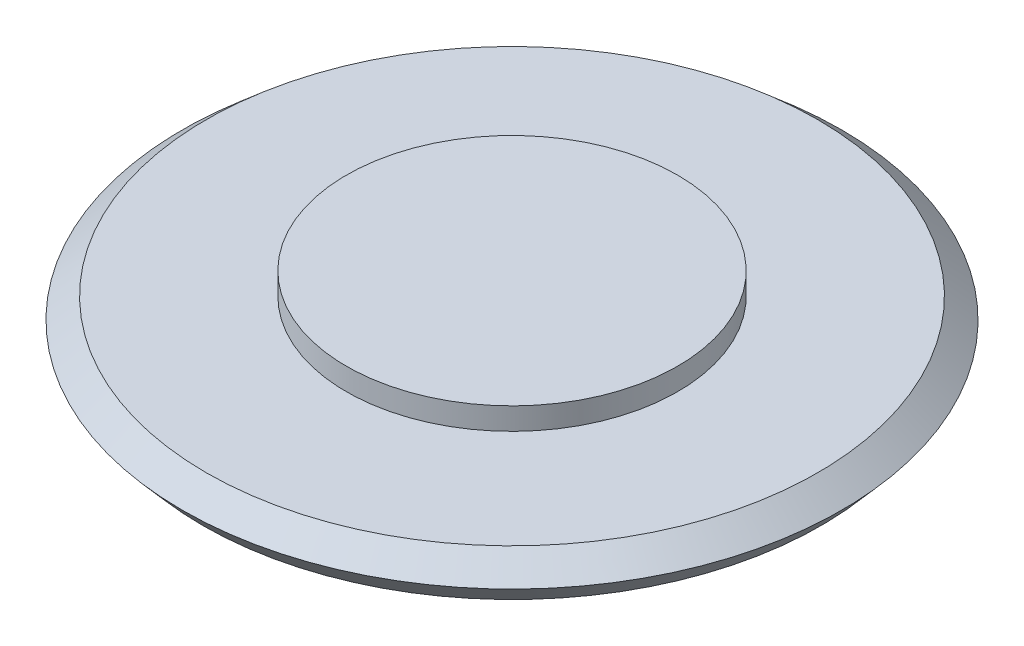
ISO-10303-21;
HEADER;
FILE_DESCRIPTION(('STEP AP214'),'2;1');
FILE_NAME('part.step','',(''),(''),'','','');
FILE_SCHEMA(('AUTOMOTIVE_DESIGN { 1 0 10303 214 1 1 1 1 }'));
ENDSEC;
DATA;
#1=APPLICATION_CONTEXT('core data for automotive mechanical design processes');
#2=APPLICATION_PROTOCOL_DEFINITION('international standard','automotive_design',2000,#1);
#3=PRODUCT_CONTEXT('',#1,'mechanical');
#4=PRODUCT('Part','Part','',(#3));
#5=PRODUCT_RELATED_PRODUCT_CATEGORY('part','',(#4));
#6=PRODUCT_DEFINITION_FORMATION('','',#4);
#7=PRODUCT_DEFINITION_CONTEXT('part definition',#1,'design');
#8=PRODUCT_DEFINITION('design','',#6,#7);
#9=PRODUCT_DEFINITION_SHAPE('','',#8);
#10=(LENGTH_UNIT() NAMED_UNIT(*) SI_UNIT(.MILLI.,.METRE.));
#11=(NAMED_UNIT(*) PLANE_ANGLE_UNIT() SI_UNIT($,.RADIAN.));
#12=(NAMED_UNIT(*) SI_UNIT($,.STERADIAN.) SOLID_ANGLE_UNIT());
#13=UNCERTAINTY_MEASURE_WITH_UNIT(LENGTH_MEASURE(1.E-05),#10,'distance_accuracy_value','');
#14=(GEOMETRIC_REPRESENTATION_CONTEXT(3) GLOBAL_UNCERTAINTY_ASSIGNED_CONTEXT((#13)) GLOBAL_UNIT_ASSIGNED_CONTEXT((#10,
#11,#12)) REPRESENTATION_CONTEXT('',''));
#15=CARTESIAN_POINT('',(0.,0.,0.));
#16=DIRECTION('',(0.,0.,1.));
#17=DIRECTION('',(1.,0.,0.));
#18=AXIS2_PLACEMENT_3D('',#15,#16,#17);
#19=CARTESIAN_POINT('',(0.,-2.,0.));
#20=DIRECTION('',(0.,1.,0.));
#21=DIRECTION('',(0.,0.,1.));
#22=AXIS2_PLACEMENT_3D('',#19,#20,#21);
#23=PLANE('',#22);
#24=CARTESIAN_POINT('',(0.,-2.,0.));
#25=DIRECTION('',(0.,-1.,0.));
#26=DIRECTION('',(0.,0.,-1.));
#27=AXIS2_PLACEMENT_3D('',#24,#25,#26);
#28=CIRCLE('',#27,15.);
#29=CARTESIAN_POINT('',(0.,-2.,-15.));
#30=VERTEX_POINT('',#29);
#31=EDGE_CURVE('E10',#30,#30,#28,.T.);
#32=ORIENTED_EDGE('',*,*,#31,.F.);
#33=EDGE_LOOP('',(#32));
#34=FACE_BOUND('',#33,.T.);
#35=CARTESIAN_POINT('',(0.,-2.,0.));
#36=DIRECTION('',(0.,1.,0.));
#37=DIRECTION('',(0.,0.,1.));
#38=AXIS2_PLACEMENT_3D('',#35,#36,#37);
#39=CIRCLE('',#38,28.);
#40=CARTESIAN_POINT('',(0.,-2.,28.));
#41=VERTEX_POINT('',#40);
#42=EDGE_CURVE('E50',#41,#41,#39,.F.);
#43=ORIENTED_EDGE('',*,*,#42,.T.);
#44=EDGE_LOOP('',(#43));
#45=FACE_BOUND('',#44,.T.);
#46=ADVANCED_FACE('F45',(#34,#45),#23,.F.);
#47=CARTESIAN_POINT('',(0.,2.,0.));
#48=DIRECTION('',(0.,1.,0.));
#49=DIRECTION('',(0.,0.,1.));
#50=AXIS2_PLACEMENT_3D('',#47,#48,#49);
#51=PLANE('',#50);
#52=CARTESIAN_POINT('',(0.,2.,0.));
#53=DIRECTION('',(0.,-1.,0.));
#54=DIRECTION('',(0.,0.,-1.));
#55=AXIS2_PLACEMENT_3D('',#52,#53,#54);
#56=CIRCLE('',#55,15.);
#57=CARTESIAN_POINT('',(0.,2.,-15.));
#58=VERTEX_POINT('',#57);
#59=EDGE_CURVE('E118',#58,#58,#56,.T.);
#60=ORIENTED_EDGE('',*,*,#59,.T.);
#61=EDGE_LOOP('',(#60));
#62=FACE_BOUND('',#61,.T.);
#63=CARTESIAN_POINT('',(0.,2.,0.));
#64=DIRECTION('',(0.,1.,0.));
#65=DIRECTION('',(0.,0.,1.));
#66=AXIS2_PLACEMENT_3D('',#63,#64,#65);
#67=CIRCLE('',#66,27.699263185558);
#68=CARTESIAN_POINT('',(0.,2.,27.699263185558));
#69=VERTEX_POINT('',#68);
#70=EDGE_CURVE('E65',#69,#69,#67,.T.);
#71=ORIENTED_EDGE('',*,*,#70,.T.);
#72=EDGE_LOOP('',(#71));
#73=FACE_BOUND('',#72,.T.);
#74=ADVANCED_FACE('F85',(#62,#73),#51,.T.);
#75=CARTESIAN_POINT('',(0.,2.,0.));
#76=DIRECTION('',(0.,-1.,0.));
#77=DIRECTION('',(0.,0.,-1.));
#78=AXIS2_PLACEMENT_3D('',#75,#76,#77);
#79=CONICAL_SURFACE('',#78,27.699263185558,0.85521133347722);
#80=CARTESIAN_POINT('',(0.,0.12944116970165,0.));
#81=DIRECTION('',(0.,1.,0.));
#82=DIRECTION('',(0.,0.,1.));
#83=AXIS2_PLACEMENT_3D('',#80,#81,#82);
#84=CIRCLE('',#83,29.8510949677815);
#85=CARTESIAN_POINT('',(0.,0.12944116970165,29.8510949677815));
#86=VERTEX_POINT('',#85);
#87=EDGE_CURVE('E60',#86,#86,#84,.T.);
#88=ORIENTED_EDGE('',*,*,#87,.T.);
#89=EDGE_LOOP('',(#88));
#90=FACE_BOUND('',#89,.T.);
#91=ORIENTED_EDGE('',*,*,#70,.F.);
#92=EDGE_LOOP('',(#91));
#93=FACE_BOUND('',#92,.T.);
#94=ADVANCED_FACE('F72',(#90,#93),#79,.T.);
#95=CARTESIAN_POINT('',(0.,0.30073681444206,0.));
#96=DIRECTION('',(0.,1.,0.));
#97=DIRECTION('',(0.,0.,1.));
#98=AXIS2_PLACEMENT_3D('',#95,#96,#97);
#99=CONICAL_SURFACE('',#98,30.,0.71558499331767);
#100=ORIENTED_EDGE('',*,*,#42,.F.);
#101=EDGE_LOOP('',(#100));
#102=FACE_BOUND('',#101,.T.);
#103=ORIENTED_EDGE('',*,*,#87,.F.);
#104=EDGE_LOOP('',(#103));
#105=FACE_BOUND('',#104,.T.);
#106=ADVANCED_FACE('F48',(#102,#105),#99,.T.);
#107=CARTESIAN_POINT('',(0.,-4.,0.));
#108=DIRECTION('',(0.,1.,0.));
#109=DIRECTION('',(0.,0.,1.));
#110=AXIS2_PLACEMENT_3D('',#107,#108,#109);
#111=CYLINDRICAL_SURFACE('',#110,15.);
#112=CARTESIAN_POINT('',(0.,-4.,0.));
#113=DIRECTION('',(0.,-1.,0.));
#114=DIRECTION('',(0.,0.,-1.));
#115=AXIS2_PLACEMENT_3D('',#112,#113,#114);
#116=CIRCLE('',#115,15.);
#117=CARTESIAN_POINT('',(0.,-4.,-15.));
#118=VERTEX_POINT('',#117);
#119=EDGE_CURVE('E63',#118,#118,#116,.T.);
#120=ORIENTED_EDGE('',*,*,#119,.F.);
#121=EDGE_LOOP('',(#120));
#122=FACE_BOUND('',#121,.T.);
#123=ORIENTED_EDGE('',*,*,#31,.T.);
#124=EDGE_LOOP('',(#123));
#125=FACE_BOUND('',#124,.T.);
#126=ADVANCED_FACE('F76',(#122,#125),#111,.T.);
#127=CARTESIAN_POINT('',(0.,-4.,0.));
#128=DIRECTION('',(0.,-1.,0.));
#129=DIRECTION('',(0.,0.,-1.));
#130=AXIS2_PLACEMENT_3D('',#127,#128,#129);
#131=PLANE('',#130);
#132=ORIENTED_EDGE('',*,*,#119,.T.);
#133=EDGE_LOOP('',(#132));
#134=FACE_BOUND('',#133,.T.);
#135=ADVANCED_FACE('F82',(#134),#131,.T.);
#136=CARTESIAN_POINT('',(0.,4.,0.));
#137=DIRECTION('',(0.,-1.,0.));
#138=DIRECTION('',(0.,0.,-1.));
#139=AXIS2_PLACEMENT_3D('',#136,#137,#138);
#140=CYLINDRICAL_SURFACE('',#139,15.);
#141=CARTESIAN_POINT('',(0.,4.,0.));
#142=DIRECTION('',(0.,-1.,0.));
#143=DIRECTION('',(0.,0.,-1.));
#144=AXIS2_PLACEMENT_3D('',#141,#142,#143);
#145=CIRCLE('',#144,15.);
#146=CARTESIAN_POINT('',(0.,4.,-15.));
#147=VERTEX_POINT('',#146);
#148=EDGE_CURVE('E116',#147,#147,#145,.T.);
#149=ORIENTED_EDGE('',*,*,#148,.T.);
#150=EDGE_LOOP('',(#149));
#151=FACE_BOUND('',#150,.T.);
#152=ORIENTED_EDGE('',*,*,#59,.F.);
#153=EDGE_LOOP('',(#152));
#154=FACE_BOUND('',#153,.T.);
#155=ADVANCED_FACE('F104',(#151,#154),#140,.T.);
#156=CARTESIAN_POINT('',(0.,4.,0.));
#157=DIRECTION('',(0.,1.,0.));
#158=DIRECTION('',(0.,0.,-1.));
#159=AXIS2_PLACEMENT_3D('',#156,#157,#158);
#160=PLANE('',#159);
#161=ORIENTED_EDGE('',*,*,#148,.F.);
#162=EDGE_LOOP('',(#161));
#163=FACE_BOUND('',#162,.T.);
#164=ADVANCED_FACE('F108',(#163),#160,.T.);
#165=CLOSED_SHELL('',(#46,#74,#94,#106,#126,#135,#155,#164));
#166=MANIFOLD_SOLID_BREP('B2',#165);
#167=ADVANCED_BREP_SHAPE_REPRESENTATION('',(#18,#166),#14);
#168=SHAPE_DEFINITION_REPRESENTATION(#9,#167);
ENDSEC;
END-ISO-10303-21;
